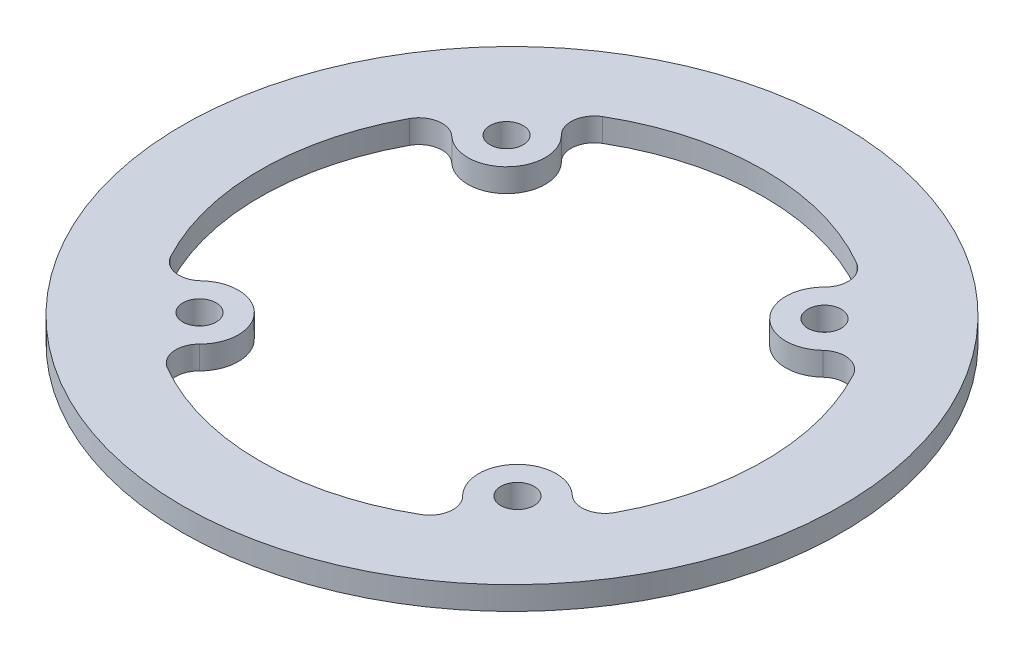
ISO-10303-21;
HEADER;
FILE_DESCRIPTION(('STEP AP214'),'2;1');
FILE_NAME('part.step','',(''),(''),'','','');
FILE_SCHEMA(('AUTOMOTIVE_DESIGN { 1 0 10303 214 1 1 1 1 }'));
ENDSEC;
DATA;
#1=APPLICATION_CONTEXT('core data for automotive mechanical design processes');
#2=APPLICATION_PROTOCOL_DEFINITION('international standard','automotive_design',2000,#1);
#3=PRODUCT_CONTEXT('',#1,'mechanical');
#4=PRODUCT('Part','Part','',(#3));
#5=PRODUCT_RELATED_PRODUCT_CATEGORY('part','',(#4));
#6=PRODUCT_DEFINITION_FORMATION('','',#4);
#7=PRODUCT_DEFINITION_CONTEXT('part definition',#1,'design');
#8=PRODUCT_DEFINITION('design','',#6,#7);
#9=PRODUCT_DEFINITION_SHAPE('','',#8);
#10=(LENGTH_UNIT() NAMED_UNIT(*) SI_UNIT(.MILLI.,.METRE.));
#11=(NAMED_UNIT(*) PLANE_ANGLE_UNIT() SI_UNIT($,.RADIAN.));
#12=(NAMED_UNIT(*) SI_UNIT($,.STERADIAN.) SOLID_ANGLE_UNIT());
#13=UNCERTAINTY_MEASURE_WITH_UNIT(LENGTH_MEASURE(1.E-05),#10,'distance_accuracy_value','');
#14=(GEOMETRIC_REPRESENTATION_CONTEXT(3) GLOBAL_UNCERTAINTY_ASSIGNED_CONTEXT((#13)) GLOBAL_UNIT_ASSIGNED_CONTEXT((#10,
#11,#12)) REPRESENTATION_CONTEXT('',''));
#15=CARTESIAN_POINT('',(0.,0.,0.));
#16=DIRECTION('',(0.,0.,1.));
#17=DIRECTION('',(1.,0.,0.));
#18=AXIS2_PLACEMENT_3D('',#15,#16,#17);
#19=CARTESIAN_POINT('',(0.,3.,0.));
#20=DIRECTION('',(0.,1.,0.));
#21=DIRECTION('',(0.,0.,1.));
#22=AXIS2_PLACEMENT_3D('',#19,#20,#21);
#23=PLANE('',#22);
#24=CARTESIAN_POINT('',(20.5,3.,-19.7989898732233));
#25=DIRECTION('',(0.,1.,0.));
#26=DIRECTION('',(0.,0.,1.));
#27=AXIS2_PLACEMENT_3D('',#24,#25,#26);
#28=CIRCLE('',#27,2.15);
#29=CARTESIAN_POINT('',(20.5,3.,-17.6489898732233));
#30=VERTEX_POINT('',#29);
#31=EDGE_CURVE('E252',#30,#30,#28,.T.);
#32=ORIENTED_EDGE('',*,*,#31,.F.);
#33=EDGE_LOOP('',(#32));
#34=FACE_BOUND('',#33,.T.);
#35=CARTESIAN_POINT('',(-20.5,3.,19.7989898732233));
#36=DIRECTION('',(0.,1.,0.));
#37=DIRECTION('',(0.,0.,1.));
#38=AXIS2_PLACEMENT_3D('',#35,#36,#37);
#39=CIRCLE('',#38,2.15);
#40=CARTESIAN_POINT('',(-20.5,3.,21.9489898732233));
#41=VERTEX_POINT('',#40);
#42=EDGE_CURVE('E251',#41,#41,#39,.T.);
#43=ORIENTED_EDGE('',*,*,#42,.F.);
#44=EDGE_LOOP('',(#43));
#45=FACE_BOUND('',#44,.T.);
#46=CARTESIAN_POINT('',(0.,3.,0.));
#47=DIRECTION('',(0.,1.,0.));
#48=DIRECTION('',(0.,0.,1.));
#49=AXIS2_PLACEMENT_3D('',#46,#47,#48);
#50=CIRCLE('',#49,42.5);
#51=CARTESIAN_POINT('',(0.,3.,42.5));
#52=VERTEX_POINT('',#51);
#53=EDGE_CURVE('E181',#52,#52,#50,.T.);
#54=ORIENTED_EDGE('',*,*,#53,.T.);
#55=EDGE_LOOP('',(#54));
#56=FACE_BOUND('',#55,.T.);
#57=CARTESIAN_POINT('',(20.5,3.,19.7989898732233));
#58=DIRECTION('',(0.,1.,0.));
#59=DIRECTION('',(0.,0.,1.));
#60=AXIS2_PLACEMENT_3D('',#57,#58,#59);
#61=CIRCLE('',#60,2.15);
#62=CARTESIAN_POINT('',(20.5,3.,21.9489898732233));
#63=VERTEX_POINT('',#62);
#64=EDGE_CURVE('E260',#63,#63,#61,.T.);
#65=ORIENTED_EDGE('',*,*,#64,.F.);
#66=EDGE_LOOP('',(#65));
#67=FACE_BOUND('',#66,.T.);
#68=CARTESIAN_POINT('',(-20.5,3.,-19.7989898732233));
#69=DIRECTION('',(0.,1.,0.));
#70=DIRECTION('',(0.,0.,1.));
#71=AXIS2_PLACEMENT_3D('',#68,#69,#70);
#72=CIRCLE('',#71,2.15);
#73=CARTESIAN_POINT('',(-20.5,3.,-17.6489898732233));
#74=VERTEX_POINT('',#73);
#75=EDGE_CURVE('E259',#74,#74,#72,.T.);
#76=ORIENTED_EDGE('',*,*,#75,.F.);
#77=EDGE_LOOP('',(#76));
#78=FACE_BOUND('',#77,.T.);
#79=CARTESIAN_POINT('',(0.,3.,0.));
#80=DIRECTION('',(0.,1.,0.));
#81=DIRECTION('',(0.,0.,1.));
#82=AXIS2_PLACEMENT_3D('',#79,#80,#81);
#83=CIRCLE('',#82,32.5);
#84=CARTESIAN_POINT('',(16.3790683172023,3.,-28.0709123660137));
#85=VERTEX_POINT('',#84);
#86=CARTESIAN_POINT('',(-16.3790683172023,3.,-28.0709123660137));
#87=VERTEX_POINT('',#86);
#88=EDGE_CURVE('E165',#85,#87,#83,.T.);
#89=ORIENTED_EDGE('',*,*,#88,.F.);
#90=CARTESIAN_POINT('',(14.8671543186913,3.,-25.4797512245355));
#91=DIRECTION('',(0.,1.,0.));
#92=DIRECTION('',(0.,0.,1.));
#93=AXIS2_PLACEMENT_3D('',#90,#91,#92);
#94=CIRCLE('',#93,3.);
#95=CARTESIAN_POINT('',(16.9794714491821,3.,-23.3494657177934));
#96=VERTEX_POINT('',#95);
#97=EDGE_CURVE('E162',#85,#96,#94,.F.);
#98=ORIENTED_EDGE('',*,*,#97,.T.);
#99=CARTESIAN_POINT('',(20.5,3.,-19.7989898732233));
#100=DIRECTION('',(0.,1.,0.));
#101=DIRECTION('',(0.,0.,1.));
#102=AXIS2_PLACEMENT_3D('',#99,#100,#101);
#103=CIRCLE('',#102,5.);
#104=CARTESIAN_POINT('',(23.9258840448161,3.,-16.1571059498295));
#105=VERTEX_POINT('',#104);
#106=EDGE_CURVE('E164',#96,#105,#103,.T.);
#107=ORIENTED_EDGE('',*,*,#106,.T.);
#108=CARTESIAN_POINT('',(25.9814144717057,3.,-13.9719755957932));
#109=DIRECTION('',(0.,1.,0.));
#110=DIRECTION('',(0.,0.,1.));
#111=AXIS2_PLACEMENT_3D('',#108,#109,#110);
#112=CIRCLE('',#111,3.);
#113=CARTESIAN_POINT('',(28.6235922145911,3.,-15.3928544699416));
#114=VERTEX_POINT('',#113);
#115=EDGE_CURVE('E224',#105,#114,#112,.F.);
#116=ORIENTED_EDGE('',*,*,#115,.T.);
#117=CARTESIAN_POINT('',(28.6235922145911,3.,15.3928544699416));
#118=VERTEX_POINT('',#117);
#119=EDGE_CURVE('E307',#118,#114,#83,.T.);
#120=ORIENTED_EDGE('',*,*,#119,.F.);
#121=CARTESIAN_POINT('',(25.9814144717057,3.,13.9719755957932));
#122=DIRECTION('',(0.,1.,0.));
#123=DIRECTION('',(0.,0.,1.));
#124=AXIS2_PLACEMENT_3D('',#121,#122,#123);
#125=CIRCLE('',#124,3.);
#126=CARTESIAN_POINT('',(23.9258840448161,3.,16.1571059498295));
#127=VERTEX_POINT('',#126);
#128=EDGE_CURVE('E228',#118,#127,#125,.F.);
#129=ORIENTED_EDGE('',*,*,#128,.T.);
#130=CARTESIAN_POINT('',(20.5,3.,19.7989898732233));
#131=DIRECTION('',(0.,1.,0.));
#132=DIRECTION('',(0.,0.,1.));
#133=AXIS2_PLACEMENT_3D('',#130,#131,#132);
#134=CIRCLE('',#133,5.);
#135=CARTESIAN_POINT('',(16.9794714491821,3.,23.3494657177934));
#136=VERTEX_POINT('',#135);
#137=EDGE_CURVE('E189',#127,#136,#134,.T.);
#138=ORIENTED_EDGE('',*,*,#137,.T.);
#139=CARTESIAN_POINT('',(14.8671543186913,3.,25.4797512245355));
#140=DIRECTION('',(0.,1.,0.));
#141=DIRECTION('',(0.,0.,1.));
#142=AXIS2_PLACEMENT_3D('',#139,#140,#141);
#143=CIRCLE('',#142,3.);
#144=CARTESIAN_POINT('',(16.3790683172023,3.,28.0709123660137));
#145=VERTEX_POINT('',#144);
#146=EDGE_CURVE('E232',#136,#145,#143,.F.);
#147=ORIENTED_EDGE('',*,*,#146,.T.);
#148=CARTESIAN_POINT('',(-16.3790683172023,3.,28.0709123660137));
#149=VERTEX_POINT('',#148);
#150=EDGE_CURVE('E311',#149,#145,#83,.T.);
#151=ORIENTED_EDGE('',*,*,#150,.F.);
#152=CARTESIAN_POINT('',(-14.8671543186913,3.,25.4797512245355));
#153=DIRECTION('',(0.,1.,0.));
#154=DIRECTION('',(0.,0.,1.));
#155=AXIS2_PLACEMENT_3D('',#152,#153,#154);
#156=CIRCLE('',#155,3.);
#157=CARTESIAN_POINT('',(-16.9794714491821,3.,23.3494657177934));
#158=VERTEX_POINT('',#157);
#159=EDGE_CURVE('E236',#149,#158,#156,.F.);
#160=ORIENTED_EDGE('',*,*,#159,.T.);
#161=CARTESIAN_POINT('',(-20.5,3.,19.7989898732233));
#162=DIRECTION('',(0.,1.,0.));
#163=DIRECTION('',(0.,0.,1.));
#164=AXIS2_PLACEMENT_3D('',#161,#162,#163);
#165=CIRCLE('',#164,5.);
#166=CARTESIAN_POINT('',(-23.9258840448161,3.,16.1571059498295));
#167=VERTEX_POINT('',#166);
#168=EDGE_CURVE('E309',#158,#167,#165,.T.);
#169=ORIENTED_EDGE('',*,*,#168,.T.);
#170=CARTESIAN_POINT('',(-25.9814144717057,3.,13.9719755957932));
#171=DIRECTION('',(0.,1.,0.));
#172=DIRECTION('',(0.,0.,1.));
#173=AXIS2_PLACEMENT_3D('',#170,#171,#172);
#174=CIRCLE('',#173,3.);
#175=CARTESIAN_POINT('',(-28.6235922145911,3.,15.3928544699416));
#176=VERTEX_POINT('',#175);
#177=EDGE_CURVE('E240',#167,#176,#174,.F.);
#178=ORIENTED_EDGE('',*,*,#177,.T.);
#179=CARTESIAN_POINT('',(-28.6235922145911,3.,-15.3928544699416));
#180=VERTEX_POINT('',#179);
#181=EDGE_CURVE('E306',#180,#176,#83,.T.);
#182=ORIENTED_EDGE('',*,*,#181,.F.);
#183=CARTESIAN_POINT('',(-25.9814144717057,3.,-13.9719755957932));
#184=DIRECTION('',(0.,1.,0.));
#185=DIRECTION('',(0.,0.,1.));
#186=AXIS2_PLACEMENT_3D('',#183,#184,#185);
#187=CIRCLE('',#186,3.);
#188=CARTESIAN_POINT('',(-23.9258840448161,3.,-16.1571059498295));
#189=VERTEX_POINT('',#188);
#190=EDGE_CURVE('E55',#180,#189,#187,.F.);
#191=ORIENTED_EDGE('',*,*,#190,.T.);
#192=CARTESIAN_POINT('',(-20.5,3.,-19.7989898732233));
#193=DIRECTION('',(0.,1.,0.));
#194=DIRECTION('',(0.,0.,1.));
#195=AXIS2_PLACEMENT_3D('',#192,#193,#194);
#196=CIRCLE('',#195,5.);
#197=CARTESIAN_POINT('',(-16.9794714491821,3.,-23.3494657177934));
#198=VERTEX_POINT('',#197);
#199=EDGE_CURVE('E305',#189,#198,#196,.T.);
#200=ORIENTED_EDGE('',*,*,#199,.T.);
#201=CARTESIAN_POINT('',(-14.8671543186913,3.,-25.4797512245355));
#202=DIRECTION('',(0.,1.,0.));
#203=DIRECTION('',(0.,0.,1.));
#204=AXIS2_PLACEMENT_3D('',#201,#202,#203);
#205=CIRCLE('',#204,3.);
#206=EDGE_CURVE('E244',#198,#87,#205,.F.);
#207=ORIENTED_EDGE('',*,*,#206,.T.);
#208=EDGE_LOOP('',(#89,#98,#107,#116,#120,#129,#138,#147,#151,#160,#169,#178,#182,#191,#200,#207));
#209=FACE_BOUND('',#208,.T.);
#210=ADVANCED_FACE('F46',(#34,#45,#56,#67,#78,#209),#23,.T.);
#211=CARTESIAN_POINT('',(0.,0.,0.));
#212=DIRECTION('',(0.,1.,0.));
#213=DIRECTION('',(0.,0.,1.));
#214=AXIS2_PLACEMENT_3D('',#211,#212,#213);
#215=PLANE('',#214);
#216=CARTESIAN_POINT('',(-20.5,0.,-19.7989898732233));
#217=DIRECTION('',(0.,1.,0.));
#218=DIRECTION('',(0.,0.,1.));
#219=AXIS2_PLACEMENT_3D('',#216,#217,#218);
#220=CIRCLE('',#219,2.15);
#221=CARTESIAN_POINT('',(-20.5,0.,-17.6489898732233));
#222=VERTEX_POINT('',#221);
#223=EDGE_CURVE('E50',#222,#222,#220,.T.);
#224=ORIENTED_EDGE('',*,*,#223,.T.);
#225=EDGE_LOOP('',(#224));
#226=FACE_BOUND('',#225,.T.);
#227=CARTESIAN_POINT('',(20.5,0.,-19.7989898732233));
#228=DIRECTION('',(0.,1.,0.));
#229=DIRECTION('',(0.,0.,1.));
#230=AXIS2_PLACEMENT_3D('',#227,#228,#229);
#231=CIRCLE('',#230,2.15);
#232=CARTESIAN_POINT('',(20.5,0.,-17.6489898732233));
#233=VERTEX_POINT('',#232);
#234=EDGE_CURVE('E256',#233,#233,#231,.T.);
#235=ORIENTED_EDGE('',*,*,#234,.T.);
#236=EDGE_LOOP('',(#235));
#237=FACE_BOUND('',#236,.T.);
#238=CARTESIAN_POINT('',(20.5,0.,19.7989898732233));
#239=DIRECTION('',(0.,1.,0.));
#240=DIRECTION('',(0.,0.,1.));
#241=AXIS2_PLACEMENT_3D('',#238,#239,#240);
#242=CIRCLE('',#241,2.15);
#243=CARTESIAN_POINT('',(20.5,0.,21.9489898732233));
#244=VERTEX_POINT('',#243);
#245=EDGE_CURVE('E255',#244,#244,#242,.T.);
#246=ORIENTED_EDGE('',*,*,#245,.T.);
#247=EDGE_LOOP('',(#246));
#248=FACE_BOUND('',#247,.T.);
#249=CARTESIAN_POINT('',(-20.5,0.,19.7989898732233));
#250=DIRECTION('',(0.,1.,0.));
#251=DIRECTION('',(0.,0.,1.));
#252=AXIS2_PLACEMENT_3D('',#249,#250,#251);
#253=CIRCLE('',#252,2.15);
#254=CARTESIAN_POINT('',(-20.5,0.,21.9489898732233));
#255=VERTEX_POINT('',#254);
#256=EDGE_CURVE('E263',#255,#255,#253,.T.);
#257=ORIENTED_EDGE('',*,*,#256,.T.);
#258=EDGE_LOOP('',(#257));
#259=FACE_BOUND('',#258,.T.);
#260=CARTESIAN_POINT('',(0.,0.,0.));
#261=DIRECTION('',(0.,1.,0.));
#262=DIRECTION('',(0.,0.,1.));
#263=AXIS2_PLACEMENT_3D('',#260,#261,#262);
#264=CIRCLE('',#263,42.5);
#265=CARTESIAN_POINT('',(0.,0.,42.5));
#266=VERTEX_POINT('',#265);
#267=EDGE_CURVE('E186',#266,#266,#264,.T.);
#268=ORIENTED_EDGE('',*,*,#267,.F.);
#269=EDGE_LOOP('',(#268));
#270=FACE_BOUND('',#269,.T.);
#271=CARTESIAN_POINT('',(20.5,0.,-19.7989898732233));
#272=DIRECTION('',(0.,1.,0.));
#273=DIRECTION('',(0.,0.,1.));
#274=AXIS2_PLACEMENT_3D('',#271,#272,#273);
#275=CIRCLE('',#274,5.);
#276=CARTESIAN_POINT('',(16.9794714491821,0.,-23.3494657177934));
#277=VERTEX_POINT('',#276);
#278=CARTESIAN_POINT('',(23.9258840448161,0.,-16.1571059498295));
#279=VERTEX_POINT('',#278);
#280=EDGE_CURVE('E288',#277,#279,#275,.T.);
#281=ORIENTED_EDGE('',*,*,#280,.F.);
#282=CARTESIAN_POINT('',(14.8671543186913,0.,-25.4797512245355));
#283=DIRECTION('',(0.,1.,0.));
#284=DIRECTION('',(0.,0.,1.));
#285=AXIS2_PLACEMENT_3D('',#282,#283,#284);
#286=CIRCLE('',#285,3.);
#287=CARTESIAN_POINT('',(16.3790683172023,0.,-28.0709123660137));
#288=VERTEX_POINT('',#287);
#289=EDGE_CURVE('E70',#277,#288,#286,.T.);
#290=ORIENTED_EDGE('',*,*,#289,.T.);
#291=CARTESIAN_POINT('',(0.,0.,0.));
#292=DIRECTION('',(0.,1.,0.));
#293=DIRECTION('',(0.,0.,1.));
#294=AXIS2_PLACEMENT_3D('',#291,#292,#293);
#295=CIRCLE('',#294,32.5);
#296=CARTESIAN_POINT('',(-16.3790683172023,0.,-28.0709123660137));
#297=VERTEX_POINT('',#296);
#298=EDGE_CURVE('E279',#288,#297,#295,.T.);
#299=ORIENTED_EDGE('',*,*,#298,.T.);
#300=CARTESIAN_POINT('',(-14.8671543186913,0.,-25.4797512245355));
#301=DIRECTION('',(0.,1.,0.));
#302=DIRECTION('',(0.,0.,1.));
#303=AXIS2_PLACEMENT_3D('',#300,#301,#302);
#304=CIRCLE('',#303,3.);
#305=CARTESIAN_POINT('',(-16.9794714491821,0.,-23.3494657177934));
#306=VERTEX_POINT('',#305);
#307=EDGE_CURVE('E170',#297,#306,#304,.T.);
#308=ORIENTED_EDGE('',*,*,#307,.T.);
#309=CARTESIAN_POINT('',(-20.5,0.,-19.7989898732233));
#310=DIRECTION('',(0.,1.,0.));
#311=DIRECTION('',(0.,0.,1.));
#312=AXIS2_PLACEMENT_3D('',#309,#310,#311);
#313=CIRCLE('',#312,5.);
#314=CARTESIAN_POINT('',(-23.9258840448161,0.,-16.1571059498295));
#315=VERTEX_POINT('',#314);
#316=EDGE_CURVE('E287',#315,#306,#313,.T.);
#317=ORIENTED_EDGE('',*,*,#316,.F.);
#318=CARTESIAN_POINT('',(-25.9814144717057,0.,-13.9719755957932));
#319=DIRECTION('',(0.,1.,0.));
#320=DIRECTION('',(0.,0.,1.));
#321=AXIS2_PLACEMENT_3D('',#318,#319,#320);
#322=CIRCLE('',#321,3.);
#323=CARTESIAN_POINT('',(-28.6235922145911,0.,-15.3928544699416));
#324=VERTEX_POINT('',#323);
#325=EDGE_CURVE('E12',#315,#324,#322,.T.);
#326=ORIENTED_EDGE('',*,*,#325,.T.);
#327=CARTESIAN_POINT('',(-28.6235922145911,0.,15.3928544699416));
#328=VERTEX_POINT('',#327);
#329=EDGE_CURVE('E289',#324,#328,#295,.T.);
#330=ORIENTED_EDGE('',*,*,#329,.T.);
#331=CARTESIAN_POINT('',(-25.9814144717057,0.,13.9719755957932));
#332=DIRECTION('',(0.,1.,0.));
#333=DIRECTION('',(0.,0.,1.));
#334=AXIS2_PLACEMENT_3D('',#331,#332,#333);
#335=CIRCLE('',#334,3.);
#336=CARTESIAN_POINT('',(-23.9258840448161,0.,16.1571059498295));
#337=VERTEX_POINT('',#336);
#338=EDGE_CURVE('E242',#328,#337,#335,.T.);
#339=ORIENTED_EDGE('',*,*,#338,.T.);
#340=CARTESIAN_POINT('',(-20.5,0.,19.7989898732233));
#341=DIRECTION('',(0.,1.,0.));
#342=DIRECTION('',(0.,0.,1.));
#343=AXIS2_PLACEMENT_3D('',#340,#341,#342);
#344=CIRCLE('',#343,5.);
#345=CARTESIAN_POINT('',(-16.9794714491821,0.,23.3494657177934));
#346=VERTEX_POINT('',#345);
#347=EDGE_CURVE('E291',#346,#337,#344,.T.);
#348=ORIENTED_EDGE('',*,*,#347,.F.);
#349=CARTESIAN_POINT('',(-14.8671543186913,0.,25.4797512245355));
#350=DIRECTION('',(0.,1.,0.));
#351=DIRECTION('',(0.,0.,1.));
#352=AXIS2_PLACEMENT_3D('',#349,#350,#351);
#353=CIRCLE('',#352,3.);
#354=CARTESIAN_POINT('',(-16.3790683172023,0.,28.0709123660137));
#355=VERTEX_POINT('',#354);
#356=EDGE_CURVE('E238',#346,#355,#353,.T.);
#357=ORIENTED_EDGE('',*,*,#356,.T.);
#358=CARTESIAN_POINT('',(16.3790683172023,0.,28.0709123660137));
#359=VERTEX_POINT('',#358);
#360=EDGE_CURVE('E280',#355,#359,#295,.T.);
#361=ORIENTED_EDGE('',*,*,#360,.T.);
#362=CARTESIAN_POINT('',(14.8671543186913,0.,25.4797512245355));
#363=DIRECTION('',(0.,1.,0.));
#364=DIRECTION('',(0.,0.,1.));
#365=AXIS2_PLACEMENT_3D('',#362,#363,#364);
#366=CIRCLE('',#365,3.);
#367=CARTESIAN_POINT('',(16.9794714491821,0.,23.3494657177934));
#368=VERTEX_POINT('',#367);
#369=EDGE_CURVE('E234',#359,#368,#366,.T.);
#370=ORIENTED_EDGE('',*,*,#369,.T.);
#371=CARTESIAN_POINT('',(20.5,0.,19.7989898732233));
#372=DIRECTION('',(0.,1.,0.));
#373=DIRECTION('',(0.,0.,1.));
#374=AXIS2_PLACEMENT_3D('',#371,#372,#373);
#375=CIRCLE('',#374,5.);
#376=CARTESIAN_POINT('',(23.9258840448161,0.,16.1571059498295));
#377=VERTEX_POINT('',#376);
#378=EDGE_CURVE('E277',#377,#368,#375,.T.);
#379=ORIENTED_EDGE('',*,*,#378,.F.);
#380=CARTESIAN_POINT('',(25.9814144717057,0.,13.9719755957932));
#381=DIRECTION('',(0.,1.,0.));
#382=DIRECTION('',(0.,0.,1.));
#383=AXIS2_PLACEMENT_3D('',#380,#381,#382);
#384=CIRCLE('',#383,3.);
#385=CARTESIAN_POINT('',(28.6235922145911,0.,15.3928544699416));
#386=VERTEX_POINT('',#385);
#387=EDGE_CURVE('E230',#377,#386,#384,.T.);
#388=ORIENTED_EDGE('',*,*,#387,.T.);
#389=CARTESIAN_POINT('',(28.6235922145911,0.,-15.3928544699416));
#390=VERTEX_POINT('',#389);
#391=EDGE_CURVE('E273',#386,#390,#295,.T.);
#392=ORIENTED_EDGE('',*,*,#391,.T.);
#393=CARTESIAN_POINT('',(25.9814144717057,0.,-13.9719755957932));
#394=DIRECTION('',(0.,1.,0.));
#395=DIRECTION('',(0.,0.,1.));
#396=AXIS2_PLACEMENT_3D('',#393,#394,#395);
#397=CIRCLE('',#396,3.);
#398=EDGE_CURVE('E226',#390,#279,#397,.T.);
#399=ORIENTED_EDGE('',*,*,#398,.T.);
#400=EDGE_LOOP('',(#281,#290,#299,#308,#317,#326,#330,#339,#348,#357,#361,#370,#379,#388,#392,#399));
#401=FACE_BOUND('',#400,.T.);
#402=ADVANCED_FACE('F324',(#226,#237,#248,#259,#270,#401),#215,.F.);
#403=CARTESIAN_POINT('',(0.,3.,0.));
#404=DIRECTION('',(0.,-1.,0.));
#405=DIRECTION('',(0.,0.,-1.));
#406=AXIS2_PLACEMENT_3D('',#403,#404,#405);
#407=CYLINDRICAL_SURFACE('',#406,42.5);
#408=ORIENTED_EDGE('',*,*,#53,.F.);
#409=EDGE_LOOP('',(#408));
#410=FACE_BOUND('',#409,.T.);
#411=ORIENTED_EDGE('',*,*,#267,.T.);
#412=EDGE_LOOP('',(#411));
#413=FACE_BOUND('',#412,.T.);
#414=ADVANCED_FACE('F374',(#410,#413),#407,.T.);
#415=CARTESIAN_POINT('',(-20.5,3.,19.7989898732233));
#416=DIRECTION('',(0.,-1.,0.));
#417=DIRECTION('',(0.,0.,-1.));
#418=AXIS2_PLACEMENT_3D('',#415,#416,#417);
#419=CYLINDRICAL_SURFACE('',#418,2.15);
#420=ORIENTED_EDGE('',*,*,#42,.T.);
#421=EDGE_LOOP('',(#420));
#422=FACE_BOUND('',#421,.T.);
#423=ORIENTED_EDGE('',*,*,#256,.F.);
#424=EDGE_LOOP('',(#423));
#425=FACE_BOUND('',#424,.T.);
#426=ADVANCED_FACE('F475',(#422,#425),#419,.F.);
#427=CARTESIAN_POINT('',(20.5,3.,19.7989898732233));
#428=DIRECTION('',(0.,-1.,0.));
#429=DIRECTION('',(0.,0.,-1.));
#430=AXIS2_PLACEMENT_3D('',#427,#428,#429);
#431=CYLINDRICAL_SURFACE('',#430,2.15);
#432=ORIENTED_EDGE('',*,*,#64,.T.);
#433=EDGE_LOOP('',(#432));
#434=FACE_BOUND('',#433,.T.);
#435=ORIENTED_EDGE('',*,*,#245,.F.);
#436=EDGE_LOOP('',(#435));
#437=FACE_BOUND('',#436,.T.);
#438=ADVANCED_FACE('F48',(#434,#437),#431,.F.);
#439=CARTESIAN_POINT('',(20.5,3.,-19.7989898732233));
#440=DIRECTION('',(0.,-1.,0.));
#441=DIRECTION('',(0.,0.,-1.));
#442=AXIS2_PLACEMENT_3D('',#439,#440,#441);
#443=CYLINDRICAL_SURFACE('',#442,2.15);
#444=ORIENTED_EDGE('',*,*,#31,.T.);
#445=EDGE_LOOP('',(#444));
#446=FACE_BOUND('',#445,.T.);
#447=ORIENTED_EDGE('',*,*,#234,.F.);
#448=EDGE_LOOP('',(#447));
#449=FACE_BOUND('',#448,.T.);
#450=ADVANCED_FACE('F496',(#446,#449),#443,.F.);
#451=CARTESIAN_POINT('',(-20.5,3.,-19.7989898732233));
#452=DIRECTION('',(0.,-1.,0.));
#453=DIRECTION('',(0.,0.,-1.));
#454=AXIS2_PLACEMENT_3D('',#451,#452,#453);
#455=CYLINDRICAL_SURFACE('',#454,2.15);
#456=ORIENTED_EDGE('',*,*,#75,.T.);
#457=EDGE_LOOP('',(#456));
#458=FACE_BOUND('',#457,.T.);
#459=ORIENTED_EDGE('',*,*,#223,.F.);
#460=EDGE_LOOP('',(#459));
#461=FACE_BOUND('',#460,.T.);
#462=ADVANCED_FACE('F380',(#458,#461),#455,.F.);
#463=CARTESIAN_POINT('',(20.5,0.,-19.7989898732233));
#464=DIRECTION('',(0.,1.,0.));
#465=DIRECTION('',(0.,0.,1.));
#466=AXIS2_PLACEMENT_3D('',#463,#464,#465);
#467=CYLINDRICAL_SURFACE('',#466,5.);
#468=ORIENTED_EDGE('',*,*,#280,.T.);
#469=DIRECTION('',(0.,1.,0.));
#470=VECTOR('',#469,1.);
#471=CARTESIAN_POINT('',(23.9258840448161,0.,-16.1571059498295));
#472=LINE('',#471,#470);
#473=EDGE_CURVE('E178',#279,#105,#472,.T.);
#474=ORIENTED_EDGE('',*,*,#473,.T.);
#475=ORIENTED_EDGE('',*,*,#106,.F.);
#476=DIRECTION('',(0.,1.,0.));
#477=VECTOR('',#476,1.);
#478=CARTESIAN_POINT('',(16.9794714491821,0.,-23.3494657177934));
#479=LINE('',#478,#477);
#480=EDGE_CURVE('E176',#96,#277,#479,.F.);
#481=ORIENTED_EDGE('',*,*,#480,.T.);
#482=EDGE_LOOP('',(#468,#474,#475,#481));
#483=FACE_BOUND('',#482,.T.);
#484=ADVANCED_FACE('F175',(#483),#467,.T.);
#485=CARTESIAN_POINT('',(0.,0.,0.));
#486=DIRECTION('',(0.,1.,0.));
#487=DIRECTION('',(0.,0.,1.));
#488=AXIS2_PLACEMENT_3D('',#485,#486,#487);
#489=CYLINDRICAL_SURFACE('',#488,32.5);
#490=ORIENTED_EDGE('',*,*,#119,.T.);
#491=DIRECTION('',(0.,1.,0.));
#492=VECTOR('',#491,1.);
#493=CARTESIAN_POINT('',(28.6235922145911,0.,-15.3928544699416));
#494=LINE('',#493,#492);
#495=EDGE_CURVE('E194',#114,#390,#494,.F.);
#496=ORIENTED_EDGE('',*,*,#495,.T.);
#497=ORIENTED_EDGE('',*,*,#391,.F.);
#498=DIRECTION('',(0.,1.,0.));
#499=VECTOR('',#498,1.);
#500=CARTESIAN_POINT('',(28.6235922145911,0.,15.3928544699416));
#501=LINE('',#500,#499);
#502=EDGE_CURVE('E183',#386,#118,#501,.T.);
#503=ORIENTED_EDGE('',*,*,#502,.T.);
#504=EDGE_LOOP('',(#490,#496,#497,#503));
#505=FACE_BOUND('',#504,.T.);
#506=ADVANCED_FACE('F351',(#505),#489,.F.);
#507=CARTESIAN_POINT('',(20.5,0.,19.7989898732233));
#508=DIRECTION('',(0.,1.,0.));
#509=DIRECTION('',(0.,0.,1.));
#510=AXIS2_PLACEMENT_3D('',#507,#508,#509);
#511=CYLINDRICAL_SURFACE('',#510,5.);
#512=ORIENTED_EDGE('',*,*,#137,.F.);
#513=DIRECTION('',(0.,1.,0.));
#514=VECTOR('',#513,1.);
#515=CARTESIAN_POINT('',(23.9258840448161,0.,16.1571059498295));
#516=LINE('',#515,#514);
#517=EDGE_CURVE('E199',#127,#377,#516,.F.);
#518=ORIENTED_EDGE('',*,*,#517,.T.);
#519=ORIENTED_EDGE('',*,*,#378,.T.);
#520=DIRECTION('',(0.,1.,0.));
#521=VECTOR('',#520,1.);
#522=CARTESIAN_POINT('',(16.9794714491821,0.,23.3494657177934));
#523=LINE('',#522,#521);
#524=EDGE_CURVE('E196',#368,#136,#523,.T.);
#525=ORIENTED_EDGE('',*,*,#524,.T.);
#526=EDGE_LOOP('',(#512,#518,#519,#525));
#527=FACE_BOUND('',#526,.T.);
#528=ADVANCED_FACE('F343',(#527),#511,.T.);
#529=ORIENTED_EDGE('',*,*,#150,.T.);
#530=DIRECTION('',(0.,1.,0.));
#531=VECTOR('',#530,1.);
#532=CARTESIAN_POINT('',(16.3790683172023,0.,28.0709123660137));
#533=LINE('',#532,#531);
#534=EDGE_CURVE('E204',#145,#359,#533,.F.);
#535=ORIENTED_EDGE('',*,*,#534,.T.);
#536=ORIENTED_EDGE('',*,*,#360,.F.);
#537=DIRECTION('',(0.,1.,0.));
#538=VECTOR('',#537,1.);
#539=CARTESIAN_POINT('',(-16.3790683172023,0.,28.0709123660137));
#540=LINE('',#539,#538);
#541=EDGE_CURVE('E201',#355,#149,#540,.T.);
#542=ORIENTED_EDGE('',*,*,#541,.T.);
#543=EDGE_LOOP('',(#529,#535,#536,#542));
#544=FACE_BOUND('',#543,.T.);
#545=ADVANCED_FACE('F333',(#544),#489,.F.);
#546=CARTESIAN_POINT('',(-20.5,0.,19.7989898732233));
#547=DIRECTION('',(0.,1.,0.));
#548=DIRECTION('',(0.,0.,1.));
#549=AXIS2_PLACEMENT_3D('',#546,#547,#548);
#550=CYLINDRICAL_SURFACE('',#549,5.);
#551=ORIENTED_EDGE('',*,*,#168,.F.);
#552=DIRECTION('',(0.,1.,0.));
#553=VECTOR('',#552,1.);
#554=CARTESIAN_POINT('',(-16.9794714491821,0.,23.3494657177934));
#555=LINE('',#554,#553);
#556=EDGE_CURVE('E209',#158,#346,#555,.F.);
#557=ORIENTED_EDGE('',*,*,#556,.T.);
#558=ORIENTED_EDGE('',*,*,#347,.T.);
#559=DIRECTION('',(0.,1.,0.));
#560=VECTOR('',#559,1.);
#561=CARTESIAN_POINT('',(-23.9258840448161,0.,16.1571059498295));
#562=LINE('',#561,#560);
#563=EDGE_CURVE('E206',#337,#167,#562,.T.);
#564=ORIENTED_EDGE('',*,*,#563,.T.);
#565=EDGE_LOOP('',(#551,#557,#558,#564));
#566=FACE_BOUND('',#565,.T.);
#567=ADVANCED_FACE('F327',(#566),#550,.T.);
#568=ORIENTED_EDGE('',*,*,#181,.T.);
#569=DIRECTION('',(0.,1.,0.));
#570=VECTOR('',#569,1.);
#571=CARTESIAN_POINT('',(-28.6235922145911,0.,15.3928544699416));
#572=LINE('',#571,#570);
#573=EDGE_CURVE('E214',#176,#328,#572,.F.);
#574=ORIENTED_EDGE('',*,*,#573,.T.);
#575=ORIENTED_EDGE('',*,*,#329,.F.);
#576=DIRECTION('',(0.,1.,0.));
#577=VECTOR('',#576,1.);
#578=CARTESIAN_POINT('',(-28.6235922145911,0.,-15.3928544699416));
#579=LINE('',#578,#577);
#580=EDGE_CURVE('E211',#324,#180,#579,.T.);
#581=ORIENTED_EDGE('',*,*,#580,.T.);
#582=EDGE_LOOP('',(#568,#574,#575,#581));
#583=FACE_BOUND('',#582,.T.);
#584=ADVANCED_FACE('F318',(#583),#489,.F.);
#585=CARTESIAN_POINT('',(-20.5,0.,-19.7989898732233));
#586=DIRECTION('',(0.,1.,0.));
#587=DIRECTION('',(0.,0.,1.));
#588=AXIS2_PLACEMENT_3D('',#585,#586,#587);
#589=CYLINDRICAL_SURFACE('',#588,5.);
#590=ORIENTED_EDGE('',*,*,#316,.T.);
#591=DIRECTION('',(0.,1.,0.));
#592=VECTOR('',#591,1.);
#593=CARTESIAN_POINT('',(-16.9794714491821,0.,-23.3494657177934));
#594=LINE('',#593,#592);
#595=EDGE_CURVE('E218',#306,#198,#594,.T.);
#596=ORIENTED_EDGE('',*,*,#595,.T.);
#597=ORIENTED_EDGE('',*,*,#199,.F.);
#598=DIRECTION('',(0.,1.,0.));
#599=VECTOR('',#598,1.);
#600=CARTESIAN_POINT('',(-23.9258840448161,0.,-16.1571059498295));
#601=LINE('',#600,#599);
#602=EDGE_CURVE('E216',#189,#315,#601,.F.);
#603=ORIENTED_EDGE('',*,*,#602,.T.);
#604=EDGE_LOOP('',(#590,#596,#597,#603));
#605=FACE_BOUND('',#604,.T.);
#606=ADVANCED_FACE('F364',(#605),#589,.T.);
#607=ORIENTED_EDGE('',*,*,#88,.T.);
#608=DIRECTION('',(0.,1.,0.));
#609=VECTOR('',#608,1.);
#610=CARTESIAN_POINT('',(-16.3790683172023,0.,-28.0709123660137));
#611=LINE('',#610,#609);
#612=EDGE_CURVE('E63',#87,#297,#611,.F.);
#613=ORIENTED_EDGE('',*,*,#612,.T.);
#614=ORIENTED_EDGE('',*,*,#298,.F.);
#615=DIRECTION('',(0.,1.,0.));
#616=VECTOR('',#615,1.);
#617=CARTESIAN_POINT('',(16.3790683172023,0.,-28.0709123660137));
#618=LINE('',#617,#616);
#619=EDGE_CURVE('E221',#288,#85,#618,.T.);
#620=ORIENTED_EDGE('',*,*,#619,.T.);
#621=EDGE_LOOP('',(#607,#613,#614,#620));
#622=FACE_BOUND('',#621,.T.);
#623=ADVANCED_FACE('F357',(#622),#489,.F.);
#624=CARTESIAN_POINT('',(25.9814144717057,0.,-13.9719755957932));
#625=DIRECTION('',(0.,1.,0.));
#626=DIRECTION('',(0.,0.,1.));
#627=AXIS2_PLACEMENT_3D('',#624,#625,#626);
#628=CYLINDRICAL_SURFACE('',#627,3.);
#629=ORIENTED_EDGE('',*,*,#398,.F.);
#630=ORIENTED_EDGE('',*,*,#495,.F.);
#631=ORIENTED_EDGE('',*,*,#115,.F.);
#632=ORIENTED_EDGE('',*,*,#473,.F.);
#633=EDGE_LOOP('',(#629,#630,#631,#632));
#634=FACE_BOUND('',#633,.T.);
#635=ADVANCED_FACE('F355',(#634),#628,.F.);
#636=CARTESIAN_POINT('',(25.9814144717057,0.,13.9719755957932));
#637=DIRECTION('',(0.,1.,0.));
#638=DIRECTION('',(0.,0.,1.));
#639=AXIS2_PLACEMENT_3D('',#636,#637,#638);
#640=CYLINDRICAL_SURFACE('',#639,3.);
#641=ORIENTED_EDGE('',*,*,#387,.F.);
#642=ORIENTED_EDGE('',*,*,#517,.F.);
#643=ORIENTED_EDGE('',*,*,#128,.F.);
#644=ORIENTED_EDGE('',*,*,#502,.F.);
#645=EDGE_LOOP('',(#641,#642,#643,#644));
#646=FACE_BOUND('',#645,.T.);
#647=ADVANCED_FACE('F347',(#646),#640,.F.);
#648=CARTESIAN_POINT('',(14.8671543186913,0.,25.4797512245355));
#649=DIRECTION('',(0.,1.,0.));
#650=DIRECTION('',(0.,0.,1.));
#651=AXIS2_PLACEMENT_3D('',#648,#649,#650);
#652=CYLINDRICAL_SURFACE('',#651,3.);
#653=ORIENTED_EDGE('',*,*,#369,.F.);
#654=ORIENTED_EDGE('',*,*,#534,.F.);
#655=ORIENTED_EDGE('',*,*,#146,.F.);
#656=ORIENTED_EDGE('',*,*,#524,.F.);
#657=EDGE_LOOP('',(#653,#654,#655,#656));
#658=FACE_BOUND('',#657,.T.);
#659=ADVANCED_FACE('F337',(#658),#652,.F.);
#660=CARTESIAN_POINT('',(-14.8671543186913,0.,25.4797512245355));
#661=DIRECTION('',(0.,1.,0.));
#662=DIRECTION('',(0.,0.,1.));
#663=AXIS2_PLACEMENT_3D('',#660,#661,#662);
#664=CYLINDRICAL_SURFACE('',#663,3.);
#665=ORIENTED_EDGE('',*,*,#356,.F.);
#666=ORIENTED_EDGE('',*,*,#556,.F.);
#667=ORIENTED_EDGE('',*,*,#159,.F.);
#668=ORIENTED_EDGE('',*,*,#541,.F.);
#669=EDGE_LOOP('',(#665,#666,#667,#668));
#670=FACE_BOUND('',#669,.T.);
#671=ADVANCED_FACE('F330',(#670),#664,.F.);
#672=CARTESIAN_POINT('',(-25.9814144717057,0.,13.9719755957932));
#673=DIRECTION('',(0.,1.,0.));
#674=DIRECTION('',(0.,0.,1.));
#675=AXIS2_PLACEMENT_3D('',#672,#673,#674);
#676=CYLINDRICAL_SURFACE('',#675,3.);
#677=ORIENTED_EDGE('',*,*,#338,.F.);
#678=ORIENTED_EDGE('',*,*,#573,.F.);
#679=ORIENTED_EDGE('',*,*,#177,.F.);
#680=ORIENTED_EDGE('',*,*,#563,.F.);
#681=EDGE_LOOP('',(#677,#678,#679,#680));
#682=FACE_BOUND('',#681,.T.);
#683=ADVANCED_FACE('F321',(#682),#676,.F.);
#684=CARTESIAN_POINT('',(-14.8671543186913,0.,-25.4797512245355));
#685=DIRECTION('',(0.,1.,0.));
#686=DIRECTION('',(0.,0.,1.));
#687=AXIS2_PLACEMENT_3D('',#684,#685,#686);
#688=CYLINDRICAL_SURFACE('',#687,3.);
#689=ORIENTED_EDGE('',*,*,#307,.F.);
#690=ORIENTED_EDGE('',*,*,#612,.F.);
#691=ORIENTED_EDGE('',*,*,#206,.F.);
#692=ORIENTED_EDGE('',*,*,#595,.F.);
#693=EDGE_LOOP('',(#689,#690,#691,#692));
#694=FACE_BOUND('',#693,.T.);
#695=ADVANCED_FACE('F443',(#694),#688,.F.);
#696=CARTESIAN_POINT('',(14.8671543186913,0.,-25.4797512245355));
#697=DIRECTION('',(0.,1.,0.));
#698=DIRECTION('',(0.,0.,1.));
#699=AXIS2_PLACEMENT_3D('',#696,#697,#698);
#700=CYLINDRICAL_SURFACE('',#699,3.);
#701=ORIENTED_EDGE('',*,*,#289,.F.);
#702=ORIENTED_EDGE('',*,*,#480,.F.);
#703=ORIENTED_EDGE('',*,*,#97,.F.);
#704=ORIENTED_EDGE('',*,*,#619,.F.);
#705=EDGE_LOOP('',(#701,#702,#703,#704));
#706=FACE_BOUND('',#705,.T.);
#707=ADVANCED_FACE('F180',(#706),#700,.F.);
#708=CARTESIAN_POINT('',(-25.9814144717057,0.,-13.9719755957932));
#709=DIRECTION('',(0.,1.,0.));
#710=DIRECTION('',(0.,0.,1.));
#711=AXIS2_PLACEMENT_3D('',#708,#709,#710);
#712=CYLINDRICAL_SURFACE('',#711,3.);
#713=ORIENTED_EDGE('',*,*,#325,.F.);
#714=ORIENTED_EDGE('',*,*,#602,.F.);
#715=ORIENTED_EDGE('',*,*,#190,.F.);
#716=ORIENTED_EDGE('',*,*,#580,.F.);
#717=EDGE_LOOP('',(#713,#714,#715,#716));
#718=FACE_BOUND('',#717,.T.);
#719=ADVANCED_FACE('F461',(#718),#712,.F.);
#720=CLOSED_SHELL('',(#210,#402,#414,#426,#438,#450,#462,#484,#506,#528,#545,#567,#584,#606,
#623,#635,#647,#659,#671,#683,#695,#707,#719));
#721=MANIFOLD_SOLID_BREP('B2',#720);
#722=ADVANCED_BREP_SHAPE_REPRESENTATION('',(#18,#721),#14);
#723=SHAPE_DEFINITION_REPRESENTATION(#9,#722);
ENDSEC;
END-ISO-10303-21;
